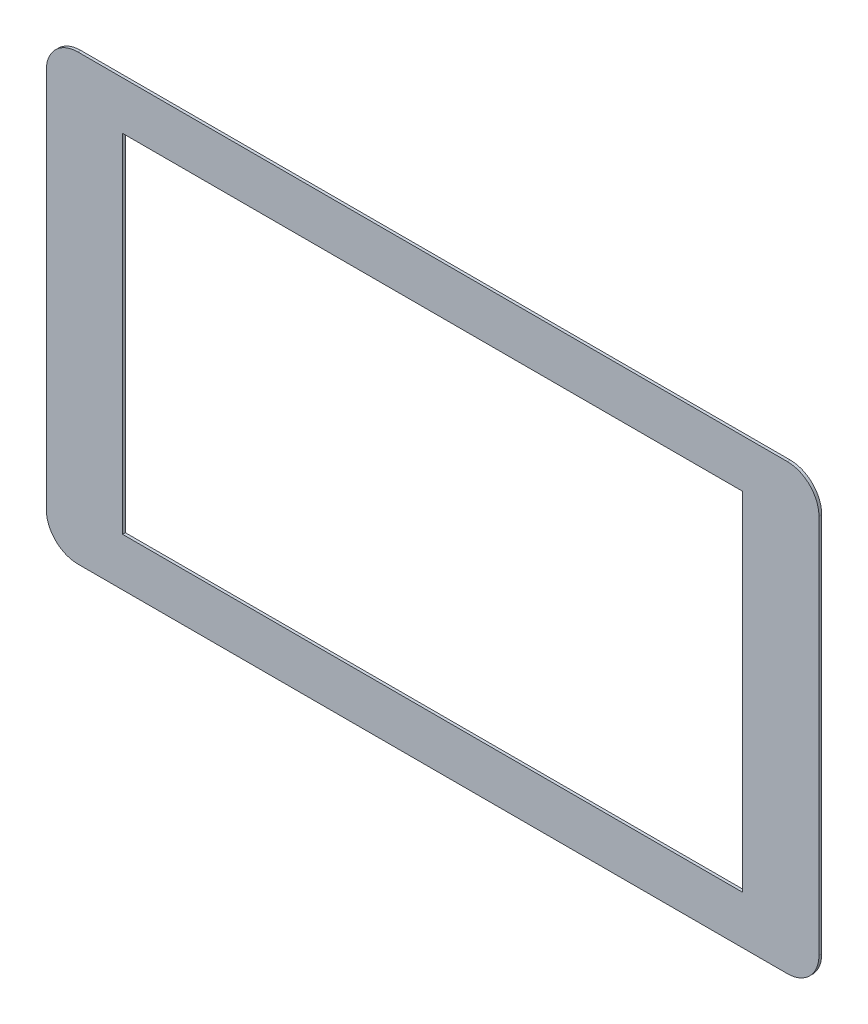
ISO-10303-21;
HEADER;
FILE_DESCRIPTION(('STEP AP214'),'2;1');
FILE_NAME('part.step','',(''),(''),'','','');
FILE_SCHEMA(('AUTOMOTIVE_DESIGN { 1 0 10303 214 1 1 1 1 }'));
ENDSEC;
DATA;
#1=APPLICATION_CONTEXT('core data for automotive mechanical design processes');
#2=APPLICATION_PROTOCOL_DEFINITION('international standard','automotive_design',2000,#1);
#3=PRODUCT_CONTEXT('',#1,'mechanical');
#4=PRODUCT('Part','Part','',(#3));
#5=PRODUCT_RELATED_PRODUCT_CATEGORY('part','',(#4));
#6=PRODUCT_DEFINITION_FORMATION('','',#4);
#7=PRODUCT_DEFINITION_CONTEXT('part definition',#1,'design');
#8=PRODUCT_DEFINITION('design','',#6,#7);
#9=PRODUCT_DEFINITION_SHAPE('','',#8);
#10=(LENGTH_UNIT() NAMED_UNIT(*) SI_UNIT(.MILLI.,.METRE.));
#11=(NAMED_UNIT(*) PLANE_ANGLE_UNIT() SI_UNIT($,.RADIAN.));
#12=(NAMED_UNIT(*) SI_UNIT($,.STERADIAN.) SOLID_ANGLE_UNIT());
#13=UNCERTAINTY_MEASURE_WITH_UNIT(LENGTH_MEASURE(1.E-05),#10,'distance_accuracy_value','');
#14=(GEOMETRIC_REPRESENTATION_CONTEXT(3) GLOBAL_UNCERTAINTY_ASSIGNED_CONTEXT((#13)) GLOBAL_UNIT_ASSIGNED_CONTEXT((#10,
#11,#12)) REPRESENTATION_CONTEXT('',''));
#15=CARTESIAN_POINT('',(0.,0.,0.));
#16=DIRECTION('',(0.,0.,1.));
#17=DIRECTION('',(1.,0.,0.));
#18=AXIS2_PLACEMENT_3D('',#15,#16,#17);
#19=CARTESIAN_POINT('',(0.,0.,0.));
#20=DIRECTION('',(0.,0.,1.));
#21=DIRECTION('',(1.,0.,0.));
#22=AXIS2_PLACEMENT_3D('',#19,#20,#21);
#23=PLANE('',#22);
#24=DIRECTION('',(1.,0.,0.));
#25=VECTOR('',#24,1.);
#26=CARTESIAN_POINT('',(77.44,-43.36,0.));
#27=LINE('',#26,#25);
#28=CARTESIAN_POINT('',(77.44,-43.36,0.));
#29=VERTEX_POINT('',#28);
#30=CARTESIAN_POINT('',(-77.44,-43.36,0.));
#31=VERTEX_POINT('',#30);
#32=EDGE_CURVE('E178',#29,#31,#27,.F.);
#33=ORIENTED_EDGE('',*,*,#32,.T.);
#34=DIRECTION('',(0.,1.,0.));
#35=VECTOR('',#34,1.);
#36=CARTESIAN_POINT('',(-77.44,-43.36,0.));
#37=LINE('',#36,#35);
#38=CARTESIAN_POINT('',(-77.44,43.36,0.));
#39=VERTEX_POINT('',#38);
#40=EDGE_CURVE('E183',#31,#39,#37,.T.);
#41=ORIENTED_EDGE('',*,*,#40,.T.);
#42=DIRECTION('',(1.,0.,0.));
#43=VECTOR('',#42,1.);
#44=CARTESIAN_POINT('',(-77.44,43.36,0.));
#45=LINE('',#44,#43);
#46=CARTESIAN_POINT('',(77.44,43.36,0.));
#47=VERTEX_POINT('',#46);
#48=EDGE_CURVE('E186',#39,#47,#45,.T.);
#49=ORIENTED_EDGE('',*,*,#48,.T.);
#50=DIRECTION('',(0.,1.,0.));
#51=VECTOR('',#50,1.);
#52=CARTESIAN_POINT('',(77.44,43.36,0.));
#53=LINE('',#52,#51);
#54=EDGE_CURVE('E172',#47,#29,#53,.F.);
#55=ORIENTED_EDGE('',*,*,#54,.T.);
#56=EDGE_LOOP('',(#33,#41,#49,#55));
#57=FACE_BOUND('',#56,.T.);
#58=DIRECTION('',(0.,1.,0.));
#59=VECTOR('',#58,1.);
#60=CARTESIAN_POINT('',(96.4800000000001,47.5,0.));
#61=LINE('',#60,#59);
#62=CARTESIAN_POINT('',(96.4800000000001,47.5,0.));
#63=VERTEX_POINT('',#62);
#64=CARTESIAN_POINT('',(96.4800000000001,-47.5,0.));
#65=VERTEX_POINT('',#64);
#66=EDGE_CURVE('E133',#63,#65,#61,.F.);
#67=ORIENTED_EDGE('',*,*,#66,.F.);
#68=CARTESIAN_POINT('',(88.6,47.5,0.));
#69=DIRECTION('',(0.,0.,-1.));
#70=DIRECTION('',(-1.,0.,0.));
#71=AXIS2_PLACEMENT_3D('',#68,#69,#70);
#72=CIRCLE('',#71,7.88000000000001);
#73=CARTESIAN_POINT('',(88.6,55.38,0.));
#74=VERTEX_POINT('',#73);
#75=EDGE_CURVE('E155',#74,#63,#72,.T.);
#76=ORIENTED_EDGE('',*,*,#75,.F.);
#77=DIRECTION('',(1.,0.,0.));
#78=VECTOR('',#77,1.);
#79=CARTESIAN_POINT('',(-88.6,55.38,0.));
#80=LINE('',#79,#78);
#81=CARTESIAN_POINT('',(-88.6,55.38,0.));
#82=VERTEX_POINT('',#81);
#83=EDGE_CURVE('E118',#82,#74,#80,.T.);
#84=ORIENTED_EDGE('',*,*,#83,.F.);
#85=CARTESIAN_POINT('',(-88.6,47.5,0.));
#86=DIRECTION('',(0.,0.,-1.));
#87=DIRECTION('',(-1.,0.,0.));
#88=AXIS2_PLACEMENT_3D('',#85,#86,#87);
#89=CIRCLE('',#88,7.88);
#90=CARTESIAN_POINT('',(-96.4800000000001,47.5,0.));
#91=VERTEX_POINT('',#90);
#92=EDGE_CURVE('E20',#91,#82,#89,.T.);
#93=ORIENTED_EDGE('',*,*,#92,.F.);
#94=DIRECTION('',(0.,1.,0.));
#95=VECTOR('',#94,1.);
#96=CARTESIAN_POINT('',(-96.4800000000001,-47.5,0.));
#97=LINE('',#96,#95);
#98=CARTESIAN_POINT('',(-96.4800000000001,-47.5,0.));
#99=VERTEX_POINT('',#98);
#100=EDGE_CURVE('E103',#99,#91,#97,.T.);
#101=ORIENTED_EDGE('',*,*,#100,.F.);
#102=CARTESIAN_POINT('',(-88.6,-47.5,0.));
#103=DIRECTION('',(0.,0.,-1.));
#104=DIRECTION('',(-1.,0.,0.));
#105=AXIS2_PLACEMENT_3D('',#102,#103,#104);
#106=CIRCLE('',#105,7.88000000000002);
#107=CARTESIAN_POINT('',(-88.6,-55.38,0.));
#108=VERTEX_POINT('',#107);
#109=EDGE_CURVE('E125',#108,#99,#106,.T.);
#110=ORIENTED_EDGE('',*,*,#109,.F.);
#111=DIRECTION('',(1.,0.,0.));
#112=VECTOR('',#111,1.);
#113=CARTESIAN_POINT('',(88.6,-55.38,0.));
#114=LINE('',#113,#112);
#115=CARTESIAN_POINT('',(88.6,-55.38,0.));
#116=VERTEX_POINT('',#115);
#117=EDGE_CURVE('E137',#116,#108,#114,.F.);
#118=ORIENTED_EDGE('',*,*,#117,.F.);
#119=CARTESIAN_POINT('',(88.6,-47.5,0.));
#120=DIRECTION('',(0.,0.,-1.));
#121=DIRECTION('',(-1.,0.,0.));
#122=AXIS2_PLACEMENT_3D('',#119,#120,#121);
#123=CIRCLE('',#122,7.88);
#124=EDGE_CURVE('E157',#65,#116,#123,.T.);
#125=ORIENTED_EDGE('',*,*,#124,.F.);
#126=EDGE_LOOP('',(#67,#76,#84,#93,#101,#110,#118,#125));
#127=FACE_BOUND('',#126,.T.);
#128=ADVANCED_FACE('F17',(#57,#127),#23,.T.);
#129=CARTESIAN_POINT('',(-88.6,47.5,0.));
#130=DIRECTION('',(0.,0.,-1.));
#131=DIRECTION('',(-1.,0.,0.));
#132=AXIS2_PLACEMENT_3D('',#129,#130,#131);
#133=CYLINDRICAL_SURFACE('',#132,7.88);
#134=CARTESIAN_POINT('',(-88.6,47.5,-0.7));
#135=DIRECTION('',(0.,0.,-1.));
#136=DIRECTION('',(-1.,0.,0.));
#137=AXIS2_PLACEMENT_3D('',#134,#135,#136);
#138=CIRCLE('',#137,7.88);
#139=CARTESIAN_POINT('',(-88.6,55.38,-0.7));
#140=VERTEX_POINT('',#139);
#141=CARTESIAN_POINT('',(-96.4800000000001,47.5,-0.7));
#142=VERTEX_POINT('',#141);
#143=EDGE_CURVE('E124',#140,#142,#138,.F.);
#144=ORIENTED_EDGE('',*,*,#143,.T.);
#145=DIRECTION('',(0.,0.,1.));
#146=VECTOR('',#145,1.);
#147=CARTESIAN_POINT('',(-96.4800000000001,47.5,0.));
#148=LINE('',#147,#146);
#149=EDGE_CURVE('E108',#91,#142,#148,.F.);
#150=ORIENTED_EDGE('',*,*,#149,.F.);
#151=ORIENTED_EDGE('',*,*,#92,.T.);
#152=DIRECTION('',(0.,0.,1.));
#153=VECTOR('',#152,1.);
#154=CARTESIAN_POINT('',(-88.6,55.38,0.));
#155=LINE('',#154,#153);
#156=EDGE_CURVE('E170',#140,#82,#155,.T.);
#157=ORIENTED_EDGE('',*,*,#156,.F.);
#158=EDGE_LOOP('',(#144,#150,#151,#157));
#159=FACE_BOUND('',#158,.T.);
#160=ADVANCED_FACE('F123',(#159),#133,.T.);
#161=CARTESIAN_POINT('',(-96.4800000000001,-47.5,0.));
#162=DIRECTION('',(-1.,0.,0.));
#163=DIRECTION('',(0.,0.,1.));
#164=AXIS2_PLACEMENT_3D('',#161,#162,#163);
#165=PLANE('',#164);
#166=DIRECTION('',(0.,1.,0.));
#167=VECTOR('',#166,1.);
#168=CARTESIAN_POINT('',(-96.4800000000001,0.,-0.7));
#169=LINE('',#168,#167);
#170=CARTESIAN_POINT('',(-96.4800000000001,-47.5,-0.7));
#171=VERTEX_POINT('',#170);
#172=EDGE_CURVE('E152',#142,#171,#169,.F.);
#173=ORIENTED_EDGE('',*,*,#172,.T.);
#174=DIRECTION('',(0.,0.,-1.));
#175=VECTOR('',#174,1.);
#176=CARTESIAN_POINT('',(-96.48,-47.5,0.));
#177=LINE('',#176,#175);
#178=EDGE_CURVE('E110',#99,#171,#177,.T.);
#179=ORIENTED_EDGE('',*,*,#178,.F.);
#180=ORIENTED_EDGE('',*,*,#100,.T.);
#181=ORIENTED_EDGE('',*,*,#149,.T.);
#182=EDGE_LOOP('',(#173,#179,#180,#181));
#183=FACE_BOUND('',#182,.T.);
#184=ADVANCED_FACE('F106',(#183),#165,.T.);
#185=CARTESIAN_POINT('',(-88.6,-47.5,0.));
#186=DIRECTION('',(0.,0.,-1.));
#187=DIRECTION('',(-1.,0.,0.));
#188=AXIS2_PLACEMENT_3D('',#185,#186,#187);
#189=CYLINDRICAL_SURFACE('',#188,7.88000000000002);
#190=CARTESIAN_POINT('',(-88.6,-47.5,-0.7));
#191=DIRECTION('',(0.,0.,-1.));
#192=DIRECTION('',(-1.,0.,0.));
#193=AXIS2_PLACEMENT_3D('',#190,#191,#192);
#194=CIRCLE('',#193,7.88000000000002);
#195=CARTESIAN_POINT('',(-88.6,-55.38,-0.7));
#196=VERTEX_POINT('',#195);
#197=EDGE_CURVE('E149',#171,#196,#194,.F.);
#198=ORIENTED_EDGE('',*,*,#197,.T.);
#199=DIRECTION('',(0.,0.,-1.));
#200=VECTOR('',#199,1.);
#201=CARTESIAN_POINT('',(-88.6,-55.38,0.));
#202=LINE('',#201,#200);
#203=EDGE_CURVE('E138',#108,#196,#202,.T.);
#204=ORIENTED_EDGE('',*,*,#203,.F.);
#205=ORIENTED_EDGE('',*,*,#109,.T.);
#206=ORIENTED_EDGE('',*,*,#178,.T.);
#207=EDGE_LOOP('',(#198,#204,#205,#206));
#208=FACE_BOUND('',#207,.T.);
#209=ADVANCED_FACE('F251',(#208),#189,.T.);
#210=CARTESIAN_POINT('',(88.6,-55.38,0.));
#211=DIRECTION('',(0.,-1.,0.));
#212=DIRECTION('',(0.,0.,-1.));
#213=AXIS2_PLACEMENT_3D('',#210,#211,#212);
#214=PLANE('',#213);
#215=DIRECTION('',(1.,0.,0.));
#216=VECTOR('',#215,1.);
#217=CARTESIAN_POINT('',(0.,-55.38,-0.7));
#218=LINE('',#217,#216);
#219=CARTESIAN_POINT('',(88.6,-55.38,-0.7));
#220=VERTEX_POINT('',#219);
#221=EDGE_CURVE('E148',#196,#220,#218,.T.);
#222=ORIENTED_EDGE('',*,*,#221,.T.);
#223=DIRECTION('',(0.,0.,-1.));
#224=VECTOR('',#223,1.);
#225=CARTESIAN_POINT('',(88.6,-55.38,0.));
#226=LINE('',#225,#224);
#227=EDGE_CURVE('E136',#116,#220,#226,.T.);
#228=ORIENTED_EDGE('',*,*,#227,.F.);
#229=ORIENTED_EDGE('',*,*,#117,.T.);
#230=ORIENTED_EDGE('',*,*,#203,.T.);
#231=EDGE_LOOP('',(#222,#228,#229,#230));
#232=FACE_BOUND('',#231,.T.);
#233=ADVANCED_FACE('F248',(#232),#214,.T.);
#234=CARTESIAN_POINT('',(88.6,-47.5,0.));
#235=DIRECTION('',(0.,0.,-1.));
#236=DIRECTION('',(-1.,0.,0.));
#237=AXIS2_PLACEMENT_3D('',#234,#235,#236);
#238=CYLINDRICAL_SURFACE('',#237,7.88);
#239=CARTESIAN_POINT('',(88.6,-47.5,-0.7));
#240=DIRECTION('',(0.,0.,-1.));
#241=DIRECTION('',(-1.,0.,0.));
#242=AXIS2_PLACEMENT_3D('',#239,#240,#241);
#243=CIRCLE('',#242,7.88);
#244=CARTESIAN_POINT('',(96.4800000000001,-47.5,-0.7));
#245=VERTEX_POINT('',#244);
#246=EDGE_CURVE('E145',#220,#245,#243,.F.);
#247=ORIENTED_EDGE('',*,*,#246,.T.);
#248=DIRECTION('',(0.,0.,-1.));
#249=VECTOR('',#248,1.);
#250=CARTESIAN_POINT('',(96.4800000000001,-47.5,0.));
#251=LINE('',#250,#249);
#252=EDGE_CURVE('E135',#65,#245,#251,.T.);
#253=ORIENTED_EDGE('',*,*,#252,.F.);
#254=ORIENTED_EDGE('',*,*,#124,.T.);
#255=ORIENTED_EDGE('',*,*,#227,.T.);
#256=EDGE_LOOP('',(#247,#253,#254,#255));
#257=FACE_BOUND('',#256,.T.);
#258=ADVANCED_FACE('F244',(#257),#238,.T.);
#259=CARTESIAN_POINT('',(96.4800000000001,47.5,0.));
#260=DIRECTION('',(1.,0.,0.));
#261=DIRECTION('',(0.,0.,-1.));
#262=AXIS2_PLACEMENT_3D('',#259,#260,#261);
#263=PLANE('',#262);
#264=DIRECTION('',(0.,1.,0.));
#265=VECTOR('',#264,1.);
#266=CARTESIAN_POINT('',(96.4800000000001,0.,-0.7));
#267=LINE('',#266,#265);
#268=CARTESIAN_POINT('',(96.4800000000001,47.5,-0.7));
#269=VERTEX_POINT('',#268);
#270=EDGE_CURVE('E144',#245,#269,#267,.T.);
#271=ORIENTED_EDGE('',*,*,#270,.T.);
#272=DIRECTION('',(0.,0.,-1.));
#273=VECTOR('',#272,1.);
#274=CARTESIAN_POINT('',(96.48,47.5,0.));
#275=LINE('',#274,#273);
#276=EDGE_CURVE('E132',#63,#269,#275,.T.);
#277=ORIENTED_EDGE('',*,*,#276,.F.);
#278=ORIENTED_EDGE('',*,*,#66,.T.);
#279=ORIENTED_EDGE('',*,*,#252,.T.);
#280=EDGE_LOOP('',(#271,#277,#278,#279));
#281=FACE_BOUND('',#280,.T.);
#282=ADVANCED_FACE('F240',(#281),#263,.T.);
#283=CARTESIAN_POINT('',(88.6,47.5,0.));
#284=DIRECTION('',(0.,0.,-1.));
#285=DIRECTION('',(-1.,0.,0.));
#286=AXIS2_PLACEMENT_3D('',#283,#284,#285);
#287=CYLINDRICAL_SURFACE('',#286,7.88000000000001);
#288=CARTESIAN_POINT('',(88.6,47.5,-0.7));
#289=DIRECTION('',(0.,0.,-1.));
#290=DIRECTION('',(-1.,0.,0.));
#291=AXIS2_PLACEMENT_3D('',#288,#289,#290);
#292=CIRCLE('',#291,7.88000000000001);
#293=CARTESIAN_POINT('',(88.6,55.38,-0.7));
#294=VERTEX_POINT('',#293);
#295=EDGE_CURVE('E140',#269,#294,#292,.F.);
#296=ORIENTED_EDGE('',*,*,#295,.T.);
#297=DIRECTION('',(0.,0.,1.));
#298=VECTOR('',#297,1.);
#299=CARTESIAN_POINT('',(88.6,55.38,0.));
#300=LINE('',#299,#298);
#301=EDGE_CURVE('E131',#74,#294,#300,.F.);
#302=ORIENTED_EDGE('',*,*,#301,.F.);
#303=ORIENTED_EDGE('',*,*,#75,.T.);
#304=ORIENTED_EDGE('',*,*,#276,.T.);
#305=EDGE_LOOP('',(#296,#302,#303,#304));
#306=FACE_BOUND('',#305,.T.);
#307=ADVANCED_FACE('F236',(#306),#287,.T.);
#308=CARTESIAN_POINT('',(-88.6,55.38,0.));
#309=DIRECTION('',(0.,1.,0.));
#310=DIRECTION('',(0.,0.,1.));
#311=AXIS2_PLACEMENT_3D('',#308,#309,#310);
#312=PLANE('',#311);
#313=DIRECTION('',(1.,0.,0.));
#314=VECTOR('',#313,1.);
#315=CARTESIAN_POINT('',(0.,55.38,-0.7));
#316=LINE('',#315,#314);
#317=EDGE_CURVE('E143',#294,#140,#316,.F.);
#318=ORIENTED_EDGE('',*,*,#317,.T.);
#319=ORIENTED_EDGE('',*,*,#156,.T.);
#320=ORIENTED_EDGE('',*,*,#83,.T.);
#321=ORIENTED_EDGE('',*,*,#301,.T.);
#322=EDGE_LOOP('',(#318,#319,#320,#321));
#323=FACE_BOUND('',#322,.T.);
#324=ADVANCED_FACE('F233',(#323),#312,.T.);
#325=CARTESIAN_POINT('',(77.44,43.36,0.));
#326=DIRECTION('',(1.,0.,0.));
#327=DIRECTION('',(0.,0.,-1.));
#328=AXIS2_PLACEMENT_3D('',#325,#326,#327);
#329=PLANE('',#328);
#330=DIRECTION('',(0.,0.,-1.));
#331=VECTOR('',#330,1.);
#332=CARTESIAN_POINT('',(77.44,-43.36,0.));
#333=LINE('',#332,#331);
#334=CARTESIAN_POINT('',(77.44,-43.36,-0.7));
#335=VERTEX_POINT('',#334);
#336=EDGE_CURVE('E175',#335,#29,#333,.F.);
#337=ORIENTED_EDGE('',*,*,#336,.T.);
#338=ORIENTED_EDGE('',*,*,#54,.F.);
#339=DIRECTION('',(0.,0.,1.));
#340=VECTOR('',#339,1.);
#341=CARTESIAN_POINT('',(77.44,43.36,0.));
#342=LINE('',#341,#340);
#343=CARTESIAN_POINT('',(77.44,43.36,-0.7));
#344=VERTEX_POINT('',#343);
#345=EDGE_CURVE('E154',#47,#344,#342,.F.);
#346=ORIENTED_EDGE('',*,*,#345,.T.);
#347=DIRECTION('',(0.,1.,0.));
#348=VECTOR('',#347,1.);
#349=CARTESIAN_POINT('',(77.44,0.,-0.7));
#350=LINE('',#349,#348);
#351=EDGE_CURVE('E197',#344,#335,#350,.F.);
#352=ORIENTED_EDGE('',*,*,#351,.T.);
#353=EDGE_LOOP('',(#337,#338,#346,#352));
#354=FACE_BOUND('',#353,.T.);
#355=ADVANCED_FACE('F216',(#354),#329,.F.);
#356=CARTESIAN_POINT('',(77.44,-43.36,0.));
#357=DIRECTION('',(0.,-1.,0.));
#358=DIRECTION('',(0.,0.,-1.));
#359=AXIS2_PLACEMENT_3D('',#356,#357,#358);
#360=PLANE('',#359);
#361=DIRECTION('',(0.,0.,1.));
#362=VECTOR('',#361,1.);
#363=CARTESIAN_POINT('',(-77.44,-43.36,0.));
#364=LINE('',#363,#362);
#365=CARTESIAN_POINT('',(-77.44,-43.36,-0.7));
#366=VERTEX_POINT('',#365);
#367=EDGE_CURVE('E180',#366,#31,#364,.T.);
#368=ORIENTED_EDGE('',*,*,#367,.T.);
#369=ORIENTED_EDGE('',*,*,#32,.F.);
#370=ORIENTED_EDGE('',*,*,#336,.F.);
#371=DIRECTION('',(1.,0.,0.));
#372=VECTOR('',#371,1.);
#373=CARTESIAN_POINT('',(0.,-43.36,-0.7));
#374=LINE('',#373,#372);
#375=EDGE_CURVE('E200',#335,#366,#374,.F.);
#376=ORIENTED_EDGE('',*,*,#375,.T.);
#377=EDGE_LOOP('',(#368,#369,#370,#376));
#378=FACE_BOUND('',#377,.T.);
#379=ADVANCED_FACE('F213',(#378),#360,.F.);
#380=CARTESIAN_POINT('',(-77.44,-43.36,0.));
#381=DIRECTION('',(-1.,0.,0.));
#382=DIRECTION('',(0.,0.,1.));
#383=AXIS2_PLACEMENT_3D('',#380,#381,#382);
#384=PLANE('',#383);
#385=DIRECTION('',(0.,0.,1.));
#386=VECTOR('',#385,1.);
#387=CARTESIAN_POINT('',(-77.44,43.36,0.));
#388=LINE('',#387,#386);
#389=CARTESIAN_POINT('',(-77.44,43.36,-0.7));
#390=VERTEX_POINT('',#389);
#391=EDGE_CURVE('E34',#390,#39,#388,.T.);
#392=ORIENTED_EDGE('',*,*,#391,.T.);
#393=ORIENTED_EDGE('',*,*,#40,.F.);
#394=ORIENTED_EDGE('',*,*,#367,.F.);
#395=DIRECTION('',(0.,1.,0.));
#396=VECTOR('',#395,1.);
#397=CARTESIAN_POINT('',(-77.44,0.,-0.7));
#398=LINE('',#397,#396);
#399=EDGE_CURVE('E26',#366,#390,#398,.T.);
#400=ORIENTED_EDGE('',*,*,#399,.T.);
#401=EDGE_LOOP('',(#392,#393,#394,#400));
#402=FACE_BOUND('',#401,.T.);
#403=ADVANCED_FACE('F206',(#402),#384,.F.);
#404=CARTESIAN_POINT('',(-77.44,43.36,0.));
#405=DIRECTION('',(0.,1.,0.));
#406=DIRECTION('',(0.,0.,1.));
#407=AXIS2_PLACEMENT_3D('',#404,#405,#406);
#408=PLANE('',#407);
#409=ORIENTED_EDGE('',*,*,#345,.F.);
#410=ORIENTED_EDGE('',*,*,#48,.F.);
#411=ORIENTED_EDGE('',*,*,#391,.F.);
#412=DIRECTION('',(1.,0.,0.));
#413=VECTOR('',#412,1.);
#414=CARTESIAN_POINT('',(0.,43.36,-0.7));
#415=LINE('',#414,#413);
#416=EDGE_CURVE('E11',#390,#344,#415,.T.);
#417=ORIENTED_EDGE('',*,*,#416,.T.);
#418=EDGE_LOOP('',(#409,#410,#411,#417));
#419=FACE_BOUND('',#418,.T.);
#420=ADVANCED_FACE('F218',(#419),#408,.F.);
#421=CARTESIAN_POINT('',(0.,0.,-0.7));
#422=DIRECTION('',(0.,0.,1.));
#423=DIRECTION('',(1.,0.,0.));
#424=AXIS2_PLACEMENT_3D('',#421,#422,#423);
#425=PLANE('',#424);
#426=ORIENTED_EDGE('',*,*,#399,.F.);
#427=ORIENTED_EDGE('',*,*,#375,.F.);
#428=ORIENTED_EDGE('',*,*,#351,.F.);
#429=ORIENTED_EDGE('',*,*,#416,.F.);
#430=EDGE_LOOP('',(#426,#427,#428,#429));
#431=FACE_BOUND('',#430,.T.);
#432=ORIENTED_EDGE('',*,*,#295,.F.);
#433=ORIENTED_EDGE('',*,*,#270,.F.);
#434=ORIENTED_EDGE('',*,*,#246,.F.);
#435=ORIENTED_EDGE('',*,*,#221,.F.);
#436=ORIENTED_EDGE('',*,*,#197,.F.);
#437=ORIENTED_EDGE('',*,*,#172,.F.);
#438=ORIENTED_EDGE('',*,*,#143,.F.);
#439=ORIENTED_EDGE('',*,*,#317,.F.);
#440=EDGE_LOOP('',(#432,#433,#434,#435,#436,#437,#438,#439));
#441=FACE_BOUND('',#440,.T.);
#442=ADVANCED_FACE('F210',(#431,#441),#425,.F.);
#443=CLOSED_SHELL('',(#128,#160,#184,#209,#233,#258,#282,#307,#324,#355,#379,#403,#420,#442));
#444=MANIFOLD_SOLID_BREP('B1',#443);
#445=ADVANCED_BREP_SHAPE_REPRESENTATION('',(#18,#444),#14);
#446=SHAPE_DEFINITION_REPRESENTATION(#9,#445);
ENDSEC;
END-ISO-10303-21;
